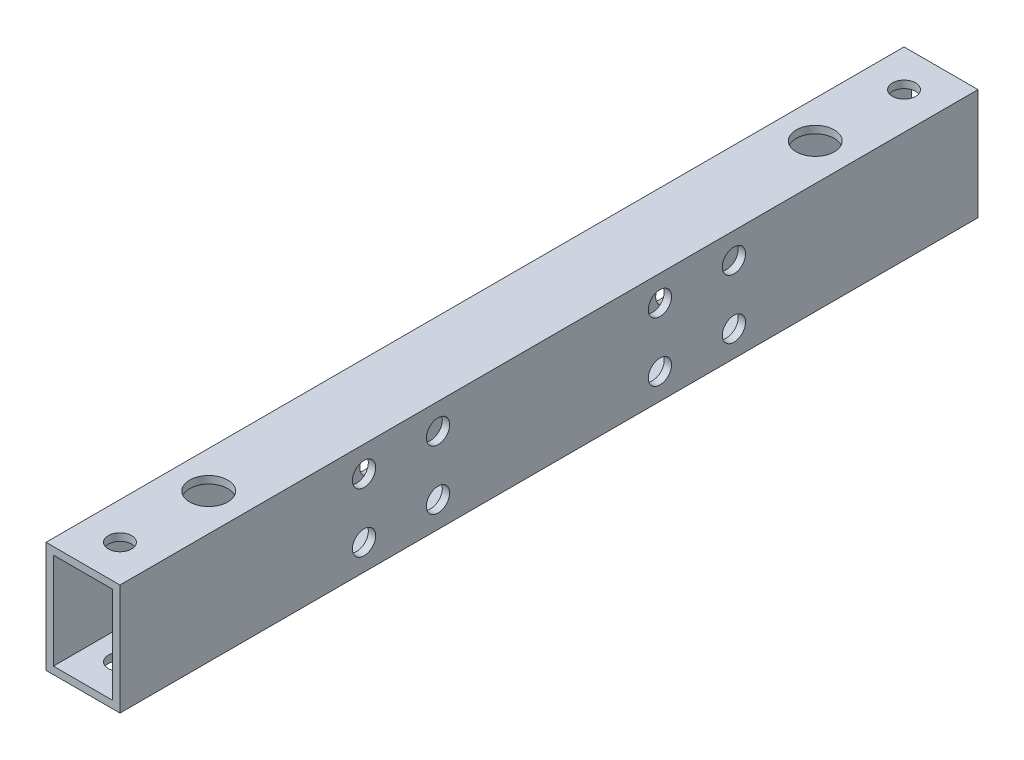
ISO-10303-21;
HEADER;
FILE_DESCRIPTION(('STEP AP214'),'2;1');
FILE_NAME('part.step','',(''),(''),'','','');
FILE_SCHEMA(('AUTOMOTIVE_DESIGN { 1 0 10303 214 1 1 1 1 }'));
ENDSEC;
DATA;
#1=APPLICATION_CONTEXT('core data for automotive mechanical design processes');
#2=APPLICATION_PROTOCOL_DEFINITION('international standard','automotive_design',2000,#1);
#3=PRODUCT_CONTEXT('',#1,'mechanical');
#4=PRODUCT('Part','Part','',(#3));
#5=PRODUCT_RELATED_PRODUCT_CATEGORY('part','',(#4));
#6=PRODUCT_DEFINITION_FORMATION('','',#4);
#7=PRODUCT_DEFINITION_CONTEXT('part definition',#1,'design');
#8=PRODUCT_DEFINITION('design','',#6,#7);
#9=PRODUCT_DEFINITION_SHAPE('','',#8);
#10=(LENGTH_UNIT() NAMED_UNIT(*) SI_UNIT(.MILLI.,.METRE.));
#11=(NAMED_UNIT(*) PLANE_ANGLE_UNIT() SI_UNIT($,.RADIAN.));
#12=(NAMED_UNIT(*) SI_UNIT($,.STERADIAN.) SOLID_ANGLE_UNIT());
#13=UNCERTAINTY_MEASURE_WITH_UNIT(LENGTH_MEASURE(1.E-05),#10,'distance_accuracy_value','');
#14=(GEOMETRIC_REPRESENTATION_CONTEXT(3) GLOBAL_UNCERTAINTY_ASSIGNED_CONTEXT((#13)) GLOBAL_UNIT_ASSIGNED_CONTEXT((#10,
#11,#12)) REPRESENTATION_CONTEXT('',''));
#15=CARTESIAN_POINT('',(0.,0.,0.));
#16=DIRECTION('',(0.,0.,1.));
#17=DIRECTION('',(1.,0.,0.));
#18=AXIS2_PLACEMENT_3D('',#15,#16,#17);
#19=CARTESIAN_POINT('',(0.,0.,116.));
#20=DIRECTION('',(0.,0.,1.));
#21=DIRECTION('',(1.,0.,0.));
#22=AXIS2_PLACEMENT_3D('',#19,#20,#21);
#23=PLANE('',#22);
#24=DIRECTION('',(0.,-1.,0.));
#25=VECTOR('',#24,1.);
#26=CARTESIAN_POINT('',(0.,0.,116.));
#27=LINE('',#26,#25);
#28=CARTESIAN_POINT('',(0.,0.,116.));
#29=VERTEX_POINT('',#28);
#30=CARTESIAN_POINT('',(0.,-15.,116.));
#31=VERTEX_POINT('',#30);
#32=EDGE_CURVE('E184',#29,#31,#27,.T.);
#33=ORIENTED_EDGE('',*,*,#32,.T.);
#34=DIRECTION('',(1.,0.,0.));
#35=VECTOR('',#34,1.);
#36=CARTESIAN_POINT('',(0.,-15.,116.));
#37=LINE('',#36,#35);
#38=CARTESIAN_POINT('',(10.,-15.,116.));
#39=VERTEX_POINT('',#38);
#40=EDGE_CURVE('E188',#31,#39,#37,.T.);
#41=ORIENTED_EDGE('',*,*,#40,.T.);
#42=DIRECTION('',(0.,-1.,0.));
#43=VECTOR('',#42,1.);
#44=CARTESIAN_POINT('',(10.,0.,116.));
#45=LINE('',#44,#43);
#46=CARTESIAN_POINT('',(10.,0.,116.));
#47=VERTEX_POINT('',#46);
#48=EDGE_CURVE('E192',#47,#39,#45,.T.);
#49=ORIENTED_EDGE('',*,*,#48,.F.);
#50=DIRECTION('',(1.,0.,0.));
#51=VECTOR('',#50,1.);
#52=CARTESIAN_POINT('',(0.,0.,116.));
#53=LINE('',#52,#51);
#54=EDGE_CURVE('E196',#29,#47,#53,.T.);
#55=ORIENTED_EDGE('',*,*,#54,.F.);
#56=EDGE_LOOP('',(#33,#41,#49,#55));
#57=FACE_BOUND('',#56,.T.);
#58=DIRECTION('',(1.,0.,0.));
#59=VECTOR('',#58,1.);
#60=CARTESIAN_POINT('',(0.,-14.,116.));
#61=LINE('',#60,#59);
#62=CARTESIAN_POINT('',(1.,-14.,116.));
#63=VERTEX_POINT('',#62);
#64=CARTESIAN_POINT('',(9.,-14.,116.));
#65=VERTEX_POINT('',#64);
#66=EDGE_CURVE('E145',#63,#65,#61,.T.);
#67=ORIENTED_EDGE('',*,*,#66,.F.);
#68=DIRECTION('',(0.,-1.,0.));
#69=VECTOR('',#68,1.);
#70=CARTESIAN_POINT('',(1.,0.,116.));
#71=LINE('',#70,#69);
#72=CARTESIAN_POINT('',(1.,-1.,116.));
#73=VERTEX_POINT('',#72);
#74=EDGE_CURVE('E135',#73,#63,#71,.T.);
#75=ORIENTED_EDGE('',*,*,#74,.F.);
#76=DIRECTION('',(1.,0.,0.));
#77=VECTOR('',#76,1.);
#78=CARTESIAN_POINT('',(0.,-1.,116.));
#79=LINE('',#78,#77);
#80=CARTESIAN_POINT('',(9.,-1.,116.));
#81=VERTEX_POINT('',#80);
#82=EDGE_CURVE('E159',#73,#81,#79,.T.);
#83=ORIENTED_EDGE('',*,*,#82,.T.);
#84=DIRECTION('',(0.,-1.,0.));
#85=VECTOR('',#84,1.);
#86=CARTESIAN_POINT('',(9.,0.,116.));
#87=LINE('',#86,#85);
#88=EDGE_CURVE('E85',#81,#65,#87,.T.);
#89=ORIENTED_EDGE('',*,*,#88,.T.);
#90=EDGE_LOOP('',(#67,#75,#83,#89));
#91=FACE_BOUND('',#90,.T.);
#92=ADVANCED_FACE('F67',(#57,#91),#23,.T.);
#93=CARTESIAN_POINT('',(0.,0.,0.));
#94=DIRECTION('',(0.,0.,1.));
#95=DIRECTION('',(1.,0.,0.));
#96=AXIS2_PLACEMENT_3D('',#93,#94,#95);
#97=PLANE('',#96);
#98=DIRECTION('',(0.,-1.,0.));
#99=VECTOR('',#98,1.);
#100=CARTESIAN_POINT('',(0.,0.,0.));
#101=LINE('',#100,#99);
#102=CARTESIAN_POINT('',(0.,0.,0.));
#103=VERTEX_POINT('',#102);
#104=CARTESIAN_POINT('',(0.,-15.,0.));
#105=VERTEX_POINT('',#104);
#106=EDGE_CURVE('E153',#103,#105,#101,.T.);
#107=ORIENTED_EDGE('',*,*,#106,.F.);
#108=DIRECTION('',(1.,0.,0.));
#109=VECTOR('',#108,1.);
#110=CARTESIAN_POINT('',(0.,0.,0.));
#111=LINE('',#110,#109);
#112=CARTESIAN_POINT('',(10.,0.,0.));
#113=VERTEX_POINT('',#112);
#114=EDGE_CURVE('E189',#103,#113,#111,.T.);
#115=ORIENTED_EDGE('',*,*,#114,.T.);
#116=DIRECTION('',(0.,-1.,0.));
#117=VECTOR('',#116,1.);
#118=CARTESIAN_POINT('',(10.,0.,0.));
#119=LINE('',#118,#117);
#120=CARTESIAN_POINT('',(10.,-15.,0.));
#121=VERTEX_POINT('',#120);
#122=EDGE_CURVE('E208',#113,#121,#119,.T.);
#123=ORIENTED_EDGE('',*,*,#122,.T.);
#124=DIRECTION('',(1.,0.,0.));
#125=VECTOR('',#124,1.);
#126=CARTESIAN_POINT('',(0.,-15.,0.));
#127=LINE('',#126,#125);
#128=EDGE_CURVE('E204',#105,#121,#127,.T.);
#129=ORIENTED_EDGE('',*,*,#128,.F.);
#130=EDGE_LOOP('',(#107,#115,#123,#129));
#131=FACE_BOUND('',#130,.T.);
#132=DIRECTION('',(0.,-1.,0.));
#133=VECTOR('',#132,1.);
#134=CARTESIAN_POINT('',(1.,0.,0.));
#135=LINE('',#134,#133);
#136=CARTESIAN_POINT('',(1.,-1.,0.));
#137=VERTEX_POINT('',#136);
#138=CARTESIAN_POINT('',(1.,-14.,0.));
#139=VERTEX_POINT('',#138);
#140=EDGE_CURVE('E93',#137,#139,#135,.T.);
#141=ORIENTED_EDGE('',*,*,#140,.T.);
#142=DIRECTION('',(1.,0.,0.));
#143=VECTOR('',#142,1.);
#144=CARTESIAN_POINT('',(0.,-14.,0.));
#145=LINE('',#144,#143);
#146=CARTESIAN_POINT('',(9.,-14.,0.));
#147=VERTEX_POINT('',#146);
#148=EDGE_CURVE('E151',#139,#147,#145,.T.);
#149=ORIENTED_EDGE('',*,*,#148,.T.);
#150=DIRECTION('',(0.,-1.,0.));
#151=VECTOR('',#150,1.);
#152=CARTESIAN_POINT('',(9.,0.,0.));
#153=LINE('',#152,#151);
#154=CARTESIAN_POINT('',(9.,-1.,0.));
#155=VERTEX_POINT('',#154);
#156=EDGE_CURVE('E170',#155,#147,#153,.T.);
#157=ORIENTED_EDGE('',*,*,#156,.F.);
#158=DIRECTION('',(1.,0.,0.));
#159=VECTOR('',#158,1.);
#160=CARTESIAN_POINT('',(0.,-1.,0.));
#161=LINE('',#160,#159);
#162=EDGE_CURVE('E146',#137,#155,#161,.T.);
#163=ORIENTED_EDGE('',*,*,#162,.F.);
#164=EDGE_LOOP('',(#141,#149,#157,#163));
#165=FACE_BOUND('',#164,.T.);
#166=ADVANCED_FACE('F368',(#131,#165),#97,.F.);
#167=CARTESIAN_POINT('',(0.,0.,116.));
#168=DIRECTION('',(1.,0.,0.));
#169=DIRECTION('',(0.,1.,0.));
#170=AXIS2_PLACEMENT_3D('',#167,#168,#169);
#171=PLANE('',#170);
#172=CARTESIAN_POINT('',(0.,-11.5,83.));
#173=DIRECTION('',(-1.,0.,0.));
#174=DIRECTION('',(0.,-1.,0.));
#175=AXIS2_PLACEMENT_3D('',#172,#173,#174);
#176=CIRCLE('',#175,1.57499999999999);
#177=CARTESIAN_POINT('',(0.,-13.075,83.));
#178=VERTEX_POINT('',#177);
#179=EDGE_CURVE('E836',#178,#178,#176,.T.);
#180=ORIENTED_EDGE('',*,*,#179,.F.);
#181=EDGE_LOOP('',(#180));
#182=FACE_BOUND('',#181,.T.);
#183=CARTESIAN_POINT('',(0.,-11.5,33.));
#184=DIRECTION('',(-1.,0.,0.));
#185=DIRECTION('',(0.,1.,0.));
#186=AXIS2_PLACEMENT_3D('',#183,#184,#185);
#187=CIRCLE('',#186,1.575);
#188=CARTESIAN_POINT('',(0.,-9.925,33.));
#189=VERTEX_POINT('',#188);
#190=EDGE_CURVE('E841',#189,#189,#187,.T.);
#191=ORIENTED_EDGE('',*,*,#190,.F.);
#192=EDGE_LOOP('',(#191));
#193=FACE_BOUND('',#192,.T.);
#194=CARTESIAN_POINT('',(0.,-11.5,43.));
#195=DIRECTION('',(-1.,0.,0.));
#196=DIRECTION('',(0.,-1.,0.));
#197=AXIS2_PLACEMENT_3D('',#194,#195,#196);
#198=CIRCLE('',#197,1.575);
#199=CARTESIAN_POINT('',(0.,-13.075,43.));
#200=VERTEX_POINT('',#199);
#201=EDGE_CURVE('E851',#200,#200,#198,.T.);
#202=ORIENTED_EDGE('',*,*,#201,.F.);
#203=EDGE_LOOP('',(#202));
#204=FACE_BOUND('',#203,.T.);
#205=CARTESIAN_POINT('',(0.,-3.5,43.));
#206=DIRECTION('',(-1.,0.,0.));
#207=DIRECTION('',(0.,1.,0.));
#208=AXIS2_PLACEMENT_3D('',#205,#206,#207);
#209=CIRCLE('',#208,1.575);
#210=CARTESIAN_POINT('',(0.,-1.925,43.));
#211=VERTEX_POINT('',#210);
#212=EDGE_CURVE('E436',#211,#211,#209,.T.);
#213=ORIENTED_EDGE('',*,*,#212,.F.);
#214=EDGE_LOOP('',(#213));
#215=FACE_BOUND('',#214,.T.);
#216=CARTESIAN_POINT('',(0.,-11.5,73.));
#217=DIRECTION('',(-1.,0.,0.));
#218=DIRECTION('',(0.,1.,0.));
#219=AXIS2_PLACEMENT_3D('',#216,#217,#218);
#220=CIRCLE('',#219,1.57500000000001);
#221=CARTESIAN_POINT('',(0.,-9.92499999999999,73.));
#222=VERTEX_POINT('',#221);
#223=EDGE_CURVE('E843',#222,#222,#220,.T.);
#224=ORIENTED_EDGE('',*,*,#223,.F.);
#225=EDGE_LOOP('',(#224));
#226=FACE_BOUND('',#225,.T.);
#227=CARTESIAN_POINT('',(0.,-3.49999999999999,73.));
#228=DIRECTION('',(-1.,0.,0.));
#229=DIRECTION('',(0.,-1.,0.));
#230=AXIS2_PLACEMENT_3D('',#227,#228,#229);
#231=CIRCLE('',#230,1.57500000000001);
#232=CARTESIAN_POINT('',(0.,-5.075,73.));
#233=VERTEX_POINT('',#232);
#234=EDGE_CURVE('E870',#233,#233,#231,.T.);
#235=ORIENTED_EDGE('',*,*,#234,.F.);
#236=EDGE_LOOP('',(#235));
#237=FACE_BOUND('',#236,.T.);
#238=CARTESIAN_POINT('',(0.,-3.49999999999999,83.));
#239=DIRECTION('',(-1.,0.,0.));
#240=DIRECTION('',(0.,1.,0.));
#241=AXIS2_PLACEMENT_3D('',#238,#239,#240);
#242=CIRCLE('',#241,1.57499999999999);
#243=CARTESIAN_POINT('',(0.,-1.925,83.));
#244=VERTEX_POINT('',#243);
#245=EDGE_CURVE('E864',#244,#244,#242,.T.);
#246=ORIENTED_EDGE('',*,*,#245,.F.);
#247=EDGE_LOOP('',(#246));
#248=FACE_BOUND('',#247,.T.);
#249=CARTESIAN_POINT('',(0.,-3.5,33.));
#250=DIRECTION('',(-1.,0.,0.));
#251=DIRECTION('',(0.,-1.,0.));
#252=AXIS2_PLACEMENT_3D('',#249,#250,#251);
#253=CIRCLE('',#252,1.575);
#254=CARTESIAN_POINT('',(0.,-5.075,33.));
#255=VERTEX_POINT('',#254);
#256=EDGE_CURVE('E432',#255,#255,#253,.T.);
#257=ORIENTED_EDGE('',*,*,#256,.F.);
#258=EDGE_LOOP('',(#257));
#259=FACE_BOUND('',#258,.T.);
#260=ORIENTED_EDGE('',*,*,#106,.T.);
#261=DIRECTION('',(0.,0.,-1.));
#262=VECTOR('',#261,1.);
#263=CARTESIAN_POINT('',(0.,-15.,116.));
#264=LINE('',#263,#262);
#265=EDGE_CURVE('E12',#31,#105,#264,.T.);
#266=ORIENTED_EDGE('',*,*,#265,.F.);
#267=ORIENTED_EDGE('',*,*,#32,.F.);
#268=DIRECTION('',(0.,0.,-1.));
#269=VECTOR('',#268,1.);
#270=CARTESIAN_POINT('',(0.,0.,116.));
#271=LINE('',#270,#269);
#272=EDGE_CURVE('E200',#29,#103,#271,.T.);
#273=ORIENTED_EDGE('',*,*,#272,.T.);
#274=EDGE_LOOP('',(#260,#266,#267,#273));
#275=FACE_BOUND('',#274,.T.);
#276=ADVANCED_FACE('F69',(#182,#193,#204,#215,#226,#237,#248,#259,#275),#171,.F.);
#277=CARTESIAN_POINT('',(0.,-15.,116.));
#278=DIRECTION('',(0.,1.,0.));
#279=DIRECTION('',(0.,0.,1.));
#280=AXIS2_PLACEMENT_3D('',#277,#278,#279);
#281=PLANE('',#280);
#282=CARTESIAN_POINT('',(5.,-15.,5.));
#283=DIRECTION('',(0.,1.,0.));
#284=DIRECTION('',(0.,0.,1.));
#285=AXIS2_PLACEMENT_3D('',#282,#283,#284);
#286=CIRCLE('',#285,1.575);
#287=CARTESIAN_POINT('',(5.,-15.,6.575));
#288=VERTEX_POINT('',#287);
#289=EDGE_CURVE('E227',#288,#288,#286,.T.);
#290=ORIENTED_EDGE('',*,*,#289,.T.);
#291=EDGE_LOOP('',(#290));
#292=FACE_BOUND('',#291,.T.);
#293=CARTESIAN_POINT('',(5.,-15.,17.));
#294=DIRECTION('',(0.,1.,0.));
#295=DIRECTION('',(0.,0.,1.));
#296=AXIS2_PLACEMENT_3D('',#293,#294,#295);
#297=CIRCLE('',#296,2.575);
#298=CARTESIAN_POINT('',(5.,-15.,19.575));
#299=VERTEX_POINT('',#298);
#300=EDGE_CURVE('E305',#299,#299,#297,.T.);
#301=ORIENTED_EDGE('',*,*,#300,.T.);
#302=EDGE_LOOP('',(#301));
#303=FACE_BOUND('',#302,.T.);
#304=CARTESIAN_POINT('',(5.,-15.,99.));
#305=DIRECTION('',(0.,1.,0.));
#306=DIRECTION('',(0.,0.,-1.));
#307=AXIS2_PLACEMENT_3D('',#304,#305,#306);
#308=CIRCLE('',#307,2.57500000000001);
#309=CARTESIAN_POINT('',(5.,-15.,96.425));
#310=VERTEX_POINT('',#309);
#311=EDGE_CURVE('E313',#310,#310,#308,.T.);
#312=ORIENTED_EDGE('',*,*,#311,.T.);
#313=EDGE_LOOP('',(#312));
#314=FACE_BOUND('',#313,.T.);
#315=CARTESIAN_POINT('',(5.,-15.,111.));
#316=DIRECTION('',(0.,1.,0.));
#317=DIRECTION('',(0.,0.,-1.));
#318=AXIS2_PLACEMENT_3D('',#315,#316,#317);
#319=CIRCLE('',#318,1.575);
#320=CARTESIAN_POINT('',(5.,-15.,109.425));
#321=VERTEX_POINT('',#320);
#322=EDGE_CURVE('E293',#321,#321,#319,.T.);
#323=ORIENTED_EDGE('',*,*,#322,.T.);
#324=EDGE_LOOP('',(#323));
#325=FACE_BOUND('',#324,.T.);
#326=ORIENTED_EDGE('',*,*,#128,.T.);
#327=DIRECTION('',(0.,0.,-1.));
#328=VECTOR('',#327,1.);
#329=CARTESIAN_POINT('',(10.,-15.,116.));
#330=LINE('',#329,#328);
#331=EDGE_CURVE('E77',#39,#121,#330,.T.);
#332=ORIENTED_EDGE('',*,*,#331,.F.);
#333=ORIENTED_EDGE('',*,*,#40,.F.);
#334=ORIENTED_EDGE('',*,*,#265,.T.);
#335=EDGE_LOOP('',(#326,#332,#333,#334));
#336=FACE_BOUND('',#335,.T.);
#337=ADVANCED_FACE('F358',(#292,#303,#314,#325,#336),#281,.F.);
#338=CARTESIAN_POINT('',(10.,0.,116.));
#339=DIRECTION('',(1.,0.,0.));
#340=DIRECTION('',(0.,1.,0.));
#341=AXIS2_PLACEMENT_3D('',#338,#339,#340);
#342=PLANE('',#341);
#343=CARTESIAN_POINT('',(10.,-11.5,83.));
#344=DIRECTION('',(-1.,0.,0.));
#345=DIRECTION('',(0.,-1.,0.));
#346=AXIS2_PLACEMENT_3D('',#343,#344,#345);
#347=CIRCLE('',#346,1.57499999999999);
#348=CARTESIAN_POINT('',(10.,-13.075,83.));
#349=VERTEX_POINT('',#348);
#350=EDGE_CURVE('E403',#349,#349,#347,.T.);
#351=ORIENTED_EDGE('',*,*,#350,.T.);
#352=EDGE_LOOP('',(#351));
#353=FACE_BOUND('',#352,.T.);
#354=CARTESIAN_POINT('',(10.,-11.5,33.));
#355=DIRECTION('',(-1.,0.,0.));
#356=DIRECTION('',(0.,1.,0.));
#357=AXIS2_PLACEMENT_3D('',#354,#355,#356);
#358=CIRCLE('',#357,1.575);
#359=CARTESIAN_POINT('',(10.,-9.925,33.));
#360=VERTEX_POINT('',#359);
#361=EDGE_CURVE('E407',#360,#360,#358,.T.);
#362=ORIENTED_EDGE('',*,*,#361,.T.);
#363=EDGE_LOOP('',(#362));
#364=FACE_BOUND('',#363,.T.);
#365=CARTESIAN_POINT('',(10.,-11.5,43.));
#366=DIRECTION('',(-1.,0.,0.));
#367=DIRECTION('',(0.,-1.,0.));
#368=AXIS2_PLACEMENT_3D('',#365,#366,#367);
#369=CIRCLE('',#368,1.575);
#370=CARTESIAN_POINT('',(10.,-13.075,43.));
#371=VERTEX_POINT('',#370);
#372=EDGE_CURVE('E411',#371,#371,#369,.T.);
#373=ORIENTED_EDGE('',*,*,#372,.T.);
#374=EDGE_LOOP('',(#373));
#375=FACE_BOUND('',#374,.T.);
#376=CARTESIAN_POINT('',(10.,-3.5,43.));
#377=DIRECTION('',(-1.,0.,0.));
#378=DIRECTION('',(0.,1.,0.));
#379=AXIS2_PLACEMENT_3D('',#376,#377,#378);
#380=CIRCLE('',#379,1.575);
#381=CARTESIAN_POINT('',(10.,-1.925,43.));
#382=VERTEX_POINT('',#381);
#383=EDGE_CURVE('E415',#382,#382,#380,.T.);
#384=ORIENTED_EDGE('',*,*,#383,.T.);
#385=EDGE_LOOP('',(#384));
#386=FACE_BOUND('',#385,.T.);
#387=CARTESIAN_POINT('',(10.,-11.5,73.));
#388=DIRECTION('',(-1.,0.,0.));
#389=DIRECTION('',(0.,1.,0.));
#390=AXIS2_PLACEMENT_3D('',#387,#388,#389);
#391=CIRCLE('',#390,1.57500000000001);
#392=CARTESIAN_POINT('',(10.,-9.92499999999999,73.));
#393=VERTEX_POINT('',#392);
#394=EDGE_CURVE('E419',#393,#393,#391,.T.);
#395=ORIENTED_EDGE('',*,*,#394,.T.);
#396=EDGE_LOOP('',(#395));
#397=FACE_BOUND('',#396,.T.);
#398=CARTESIAN_POINT('',(10.,-3.49999999999999,73.));
#399=DIRECTION('',(-1.,0.,0.));
#400=DIRECTION('',(0.,-1.,0.));
#401=AXIS2_PLACEMENT_3D('',#398,#399,#400);
#402=CIRCLE('',#401,1.57500000000001);
#403=CARTESIAN_POINT('',(10.,-5.075,73.));
#404=VERTEX_POINT('',#403);
#405=EDGE_CURVE('E423',#404,#404,#402,.T.);
#406=ORIENTED_EDGE('',*,*,#405,.T.);
#407=EDGE_LOOP('',(#406));
#408=FACE_BOUND('',#407,.T.);
#409=CARTESIAN_POINT('',(10.,-3.49999999999999,83.));
#410=DIRECTION('',(-1.,0.,0.));
#411=DIRECTION('',(0.,1.,0.));
#412=AXIS2_PLACEMENT_3D('',#409,#410,#411);
#413=CIRCLE('',#412,1.57499999999999);
#414=CARTESIAN_POINT('',(10.,-1.925,83.));
#415=VERTEX_POINT('',#414);
#416=EDGE_CURVE('E427',#415,#415,#413,.T.);
#417=ORIENTED_EDGE('',*,*,#416,.T.);
#418=EDGE_LOOP('',(#417));
#419=FACE_BOUND('',#418,.T.);
#420=CARTESIAN_POINT('',(10.,-3.5,33.));
#421=DIRECTION('',(-1.,0.,0.));
#422=DIRECTION('',(0.,-1.,0.));
#423=AXIS2_PLACEMENT_3D('',#420,#421,#422);
#424=CIRCLE('',#423,1.575);
#425=CARTESIAN_POINT('',(10.,-5.075,33.));
#426=VERTEX_POINT('',#425);
#427=EDGE_CURVE('E247',#426,#426,#424,.T.);
#428=ORIENTED_EDGE('',*,*,#427,.T.);
#429=EDGE_LOOP('',(#428));
#430=FACE_BOUND('',#429,.T.);
#431=ORIENTED_EDGE('',*,*,#122,.F.);
#432=DIRECTION('',(0.,0.,-1.));
#433=VECTOR('',#432,1.);
#434=CARTESIAN_POINT('',(10.,0.,116.));
#435=LINE('',#434,#433);
#436=EDGE_CURVE('E217',#47,#113,#435,.T.);
#437=ORIENTED_EDGE('',*,*,#436,.F.);
#438=ORIENTED_EDGE('',*,*,#48,.T.);
#439=ORIENTED_EDGE('',*,*,#331,.T.);
#440=EDGE_LOOP('',(#431,#437,#438,#439));
#441=FACE_BOUND('',#440,.T.);
#442=ADVANCED_FACE('F361',(#353,#364,#375,#386,#397,#408,#419,#430,#441),#342,.T.);
#443=CARTESIAN_POINT('',(0.,0.,116.));
#444=DIRECTION('',(0.,1.,0.));
#445=DIRECTION('',(0.,0.,1.));
#446=AXIS2_PLACEMENT_3D('',#443,#444,#445);
#447=PLANE('',#446);
#448=CARTESIAN_POINT('',(5.,0.,5.));
#449=DIRECTION('',(0.,1.,0.));
#450=DIRECTION('',(0.,0.,1.));
#451=AXIS2_PLACEMENT_3D('',#448,#449,#450);
#452=CIRCLE('',#451,1.575);
#453=CARTESIAN_POINT('',(5.,0.,6.575));
#454=VERTEX_POINT('',#453);
#455=EDGE_CURVE('E297',#454,#454,#452,.T.);
#456=ORIENTED_EDGE('',*,*,#455,.F.);
#457=EDGE_LOOP('',(#456));
#458=FACE_BOUND('',#457,.T.);
#459=CARTESIAN_POINT('',(5.,0.,17.));
#460=DIRECTION('',(0.,1.,0.));
#461=DIRECTION('',(0.,0.,1.));
#462=AXIS2_PLACEMENT_3D('',#459,#460,#461);
#463=CIRCLE('',#462,2.575);
#464=CARTESIAN_POINT('',(5.,0.,19.575));
#465=VERTEX_POINT('',#464);
#466=EDGE_CURVE('E301',#465,#465,#463,.T.);
#467=ORIENTED_EDGE('',*,*,#466,.F.);
#468=EDGE_LOOP('',(#467));
#469=FACE_BOUND('',#468,.T.);
#470=CARTESIAN_POINT('',(5.,0.,99.));
#471=DIRECTION('',(0.,1.,0.));
#472=DIRECTION('',(0.,0.,-1.));
#473=AXIS2_PLACEMENT_3D('',#470,#471,#472);
#474=CIRCLE('',#473,2.57500000000001);
#475=CARTESIAN_POINT('',(5.,0.,96.425));
#476=VERTEX_POINT('',#475);
#477=EDGE_CURVE('E309',#476,#476,#474,.T.);
#478=ORIENTED_EDGE('',*,*,#477,.F.);
#479=EDGE_LOOP('',(#478));
#480=FACE_BOUND('',#479,.T.);
#481=CARTESIAN_POINT('',(5.,0.,111.));
#482=DIRECTION('',(0.,1.,0.));
#483=DIRECTION('',(0.,0.,-1.));
#484=AXIS2_PLACEMENT_3D('',#481,#482,#483);
#485=CIRCLE('',#484,1.575);
#486=CARTESIAN_POINT('',(5.,0.,109.425));
#487=VERTEX_POINT('',#486);
#488=EDGE_CURVE('E317',#487,#487,#485,.T.);
#489=ORIENTED_EDGE('',*,*,#488,.F.);
#490=EDGE_LOOP('',(#489));
#491=FACE_BOUND('',#490,.T.);
#492=ORIENTED_EDGE('',*,*,#114,.F.);
#493=ORIENTED_EDGE('',*,*,#272,.F.);
#494=ORIENTED_EDGE('',*,*,#54,.T.);
#495=ORIENTED_EDGE('',*,*,#436,.T.);
#496=EDGE_LOOP('',(#492,#493,#494,#495));
#497=FACE_BOUND('',#496,.T.);
#498=ADVANCED_FACE('F376',(#458,#469,#480,#491,#497),#447,.T.);
#499=CARTESIAN_POINT('',(1.,0.,116.));
#500=DIRECTION('',(1.,0.,0.));
#501=DIRECTION('',(0.,1.,0.));
#502=AXIS2_PLACEMENT_3D('',#499,#500,#501);
#503=PLANE('',#502);
#504=CARTESIAN_POINT('',(1.,-11.5,83.));
#505=DIRECTION('',(1.,0.,0.));
#506=DIRECTION('',(0.,1.,0.));
#507=AXIS2_PLACEMENT_3D('',#504,#505,#506);
#508=CIRCLE('',#507,1.57499999999999);
#509=CARTESIAN_POINT('',(1.,-9.925,83.));
#510=VERTEX_POINT('',#509);
#511=EDGE_CURVE('E289',#510,#510,#508,.T.);
#512=ORIENTED_EDGE('',*,*,#511,.F.);
#513=EDGE_LOOP('',(#512));
#514=FACE_BOUND('',#513,.T.);
#515=CARTESIAN_POINT('',(1.,-11.5,33.));
#516=DIRECTION('',(1.,0.,0.));
#517=DIRECTION('',(0.,1.,0.));
#518=AXIS2_PLACEMENT_3D('',#515,#516,#517);
#519=CIRCLE('',#518,1.575);
#520=CARTESIAN_POINT('',(1.,-9.925,33.));
#521=VERTEX_POINT('',#520);
#522=EDGE_CURVE('E275',#521,#521,#519,.T.);
#523=ORIENTED_EDGE('',*,*,#522,.F.);
#524=EDGE_LOOP('',(#523));
#525=FACE_BOUND('',#524,.T.);
#526=CARTESIAN_POINT('',(1.,-11.5,43.));
#527=DIRECTION('',(1.,0.,0.));
#528=DIRECTION('',(0.,1.,0.));
#529=AXIS2_PLACEMENT_3D('',#526,#527,#528);
#530=CIRCLE('',#529,1.575);
#531=CARTESIAN_POINT('',(1.,-9.925,43.));
#532=VERTEX_POINT('',#531);
#533=EDGE_CURVE('E271',#532,#532,#530,.T.);
#534=ORIENTED_EDGE('',*,*,#533,.F.);
#535=EDGE_LOOP('',(#534));
#536=FACE_BOUND('',#535,.T.);
#537=CARTESIAN_POINT('',(1.,-3.5,43.));
#538=DIRECTION('',(1.,0.,0.));
#539=DIRECTION('',(0.,1.,0.));
#540=AXIS2_PLACEMENT_3D('',#537,#538,#539);
#541=CIRCLE('',#540,1.575);
#542=CARTESIAN_POINT('',(1.,-1.925,43.));
#543=VERTEX_POINT('',#542);
#544=EDGE_CURVE('E267',#543,#543,#541,.T.);
#545=ORIENTED_EDGE('',*,*,#544,.F.);
#546=EDGE_LOOP('',(#545));
#547=FACE_BOUND('',#546,.T.);
#548=CARTESIAN_POINT('',(1.,-11.5,73.));
#549=DIRECTION('',(1.,0.,0.));
#550=DIRECTION('',(0.,1.,0.));
#551=AXIS2_PLACEMENT_3D('',#548,#549,#550);
#552=CIRCLE('',#551,1.57500000000001);
#553=CARTESIAN_POINT('',(1.,-9.92499999999999,73.));
#554=VERTEX_POINT('',#553);
#555=EDGE_CURVE('E262',#554,#554,#552,.T.);
#556=ORIENTED_EDGE('',*,*,#555,.F.);
#557=EDGE_LOOP('',(#556));
#558=FACE_BOUND('',#557,.T.);
#559=CARTESIAN_POINT('',(1.,-3.49999999999999,73.));
#560=DIRECTION('',(1.,0.,0.));
#561=DIRECTION('',(0.,1.,0.));
#562=AXIS2_PLACEMENT_3D('',#559,#560,#561);
#563=CIRCLE('',#562,1.57500000000001);
#564=CARTESIAN_POINT('',(1.,-1.92499999999999,73.));
#565=VERTEX_POINT('',#564);
#566=EDGE_CURVE('E257',#565,#565,#563,.T.);
#567=ORIENTED_EDGE('',*,*,#566,.F.);
#568=EDGE_LOOP('',(#567));
#569=FACE_BOUND('',#568,.T.);
#570=CARTESIAN_POINT('',(1.,-3.49999999999999,83.));
#571=DIRECTION('',(1.,0.,0.));
#572=DIRECTION('',(0.,1.,0.));
#573=AXIS2_PLACEMENT_3D('',#570,#571,#572);
#574=CIRCLE('',#573,1.57499999999999);
#575=CARTESIAN_POINT('',(1.,-1.925,83.));
#576=VERTEX_POINT('',#575);
#577=EDGE_CURVE('E252',#576,#576,#574,.T.);
#578=ORIENTED_EDGE('',*,*,#577,.F.);
#579=EDGE_LOOP('',(#578));
#580=FACE_BOUND('',#579,.T.);
#581=CARTESIAN_POINT('',(1.,-3.5,33.));
#582=DIRECTION('',(1.,0.,0.));
#583=DIRECTION('',(0.,1.,0.));
#584=AXIS2_PLACEMENT_3D('',#581,#582,#583);
#585=CIRCLE('',#584,1.575);
#586=CARTESIAN_POINT('',(1.,-1.925,33.));
#587=VERTEX_POINT('',#586);
#588=EDGE_CURVE('E246',#587,#587,#585,.T.);
#589=ORIENTED_EDGE('',*,*,#588,.F.);
#590=EDGE_LOOP('',(#589));
#591=FACE_BOUND('',#590,.T.);
#592=ORIENTED_EDGE('',*,*,#140,.F.);
#593=DIRECTION('',(0.,0.,-1.));
#594=VECTOR('',#593,1.);
#595=CARTESIAN_POINT('',(1.,-1.,116.));
#596=LINE('',#595,#594);
#597=EDGE_CURVE('E139',#73,#137,#596,.T.);
#598=ORIENTED_EDGE('',*,*,#597,.F.);
#599=ORIENTED_EDGE('',*,*,#74,.T.);
#600=DIRECTION('',(0.,0.,-1.));
#601=VECTOR('',#600,1.);
#602=CARTESIAN_POINT('',(1.,-14.,116.));
#603=LINE('',#602,#601);
#604=EDGE_CURVE('E138',#63,#139,#603,.T.);
#605=ORIENTED_EDGE('',*,*,#604,.T.);
#606=EDGE_LOOP('',(#592,#598,#599,#605));
#607=FACE_BOUND('',#606,.T.);
#608=ADVANCED_FACE('F137',(#514,#525,#536,#547,#558,#569,#580,#591,#607),#503,.T.);
#609=CARTESIAN_POINT('',(0.,-14.,116.));
#610=DIRECTION('',(0.,1.,0.));
#611=DIRECTION('',(0.,0.,1.));
#612=AXIS2_PLACEMENT_3D('',#609,#610,#611);
#613=PLANE('',#612);
#614=CARTESIAN_POINT('',(5.,-14.,5.));
#615=DIRECTION('',(0.,1.,0.));
#616=DIRECTION('',(0.,0.,1.));
#617=AXIS2_PLACEMENT_3D('',#614,#615,#616);
#618=CIRCLE('',#617,1.575);
#619=CARTESIAN_POINT('',(5.,-14.,6.575));
#620=VERTEX_POINT('',#619);
#621=EDGE_CURVE('E167',#620,#620,#618,.T.);
#622=ORIENTED_EDGE('',*,*,#621,.F.);
#623=EDGE_LOOP('',(#622));
#624=FACE_BOUND('',#623,.T.);
#625=CARTESIAN_POINT('',(5.,-14.,17.));
#626=DIRECTION('',(0.,1.,0.));
#627=DIRECTION('',(0.,0.,1.));
#628=AXIS2_PLACEMENT_3D('',#625,#626,#627);
#629=CIRCLE('',#628,2.575);
#630=CARTESIAN_POINT('',(5.,-14.,19.575));
#631=VERTEX_POINT('',#630);
#632=EDGE_CURVE('E237',#631,#631,#629,.T.);
#633=ORIENTED_EDGE('',*,*,#632,.F.);
#634=EDGE_LOOP('',(#633));
#635=FACE_BOUND('',#634,.T.);
#636=CARTESIAN_POINT('',(5.,-14.,99.));
#637=DIRECTION('',(0.,1.,0.));
#638=DIRECTION('',(0.,0.,1.));
#639=AXIS2_PLACEMENT_3D('',#636,#637,#638);
#640=CIRCLE('',#639,2.57500000000001);
#641=CARTESIAN_POINT('',(5.,-14.,101.575));
#642=VERTEX_POINT('',#641);
#643=EDGE_CURVE('E232',#642,#642,#640,.T.);
#644=ORIENTED_EDGE('',*,*,#643,.F.);
#645=EDGE_LOOP('',(#644));
#646=FACE_BOUND('',#645,.T.);
#647=CARTESIAN_POINT('',(5.,-14.,111.));
#648=DIRECTION('',(0.,1.,0.));
#649=DIRECTION('',(0.,0.,1.));
#650=AXIS2_PLACEMENT_3D('',#647,#648,#649);
#651=CIRCLE('',#650,1.575);
#652=CARTESIAN_POINT('',(5.,-14.,112.575));
#653=VERTEX_POINT('',#652);
#654=EDGE_CURVE('E226',#653,#653,#651,.T.);
#655=ORIENTED_EDGE('',*,*,#654,.F.);
#656=EDGE_LOOP('',(#655));
#657=FACE_BOUND('',#656,.T.);
#658=ORIENTED_EDGE('',*,*,#148,.F.);
#659=ORIENTED_EDGE('',*,*,#604,.F.);
#660=ORIENTED_EDGE('',*,*,#66,.T.);
#661=DIRECTION('',(0.,0.,-1.));
#662=VECTOR('',#661,1.);
#663=CARTESIAN_POINT('',(9.,-14.,116.));
#664=LINE('',#663,#662);
#665=EDGE_CURVE('E154',#65,#147,#664,.T.);
#666=ORIENTED_EDGE('',*,*,#665,.T.);
#667=EDGE_LOOP('',(#658,#659,#660,#666));
#668=FACE_BOUND('',#667,.T.);
#669=ADVANCED_FACE('F149',(#624,#635,#646,#657,#668),#613,.T.);
#670=CARTESIAN_POINT('',(9.,0.,116.));
#671=DIRECTION('',(1.,0.,0.));
#672=DIRECTION('',(0.,1.,0.));
#673=AXIS2_PLACEMENT_3D('',#670,#671,#672);
#674=PLANE('',#673);
#675=CARTESIAN_POINT('',(9.,-11.5,83.));
#676=DIRECTION('',(1.,0.,0.));
#677=DIRECTION('',(0.,1.,0.));
#678=AXIS2_PLACEMENT_3D('',#675,#676,#677);
#679=CIRCLE('',#678,1.57499999999999);
#680=CARTESIAN_POINT('',(9.,-9.925,83.));
#681=VERTEX_POINT('',#680);
#682=EDGE_CURVE('E71',#681,#681,#679,.T.);
#683=ORIENTED_EDGE('',*,*,#682,.T.);
#684=EDGE_LOOP('',(#683));
#685=FACE_BOUND('',#684,.T.);
#686=CARTESIAN_POINT('',(9.,-11.5,33.));
#687=DIRECTION('',(1.,0.,0.));
#688=DIRECTION('',(0.,1.,0.));
#689=AXIS2_PLACEMENT_3D('',#686,#687,#688);
#690=CIRCLE('',#689,1.575);
#691=CARTESIAN_POINT('',(9.,-9.925,33.));
#692=VERTEX_POINT('',#691);
#693=EDGE_CURVE('E272',#692,#692,#690,.T.);
#694=ORIENTED_EDGE('',*,*,#693,.T.);
#695=EDGE_LOOP('',(#694));
#696=FACE_BOUND('',#695,.T.);
#697=CARTESIAN_POINT('',(9.,-11.5,43.));
#698=DIRECTION('',(1.,0.,0.));
#699=DIRECTION('',(0.,1.,0.));
#700=AXIS2_PLACEMENT_3D('',#697,#698,#699);
#701=CIRCLE('',#700,1.575);
#702=CARTESIAN_POINT('',(9.,-9.925,43.));
#703=VERTEX_POINT('',#702);
#704=EDGE_CURVE('E268',#703,#703,#701,.T.);
#705=ORIENTED_EDGE('',*,*,#704,.T.);
#706=EDGE_LOOP('',(#705));
#707=FACE_BOUND('',#706,.T.);
#708=CARTESIAN_POINT('',(9.,-3.5,43.));
#709=DIRECTION('',(1.,0.,0.));
#710=DIRECTION('',(0.,1.,0.));
#711=AXIS2_PLACEMENT_3D('',#708,#709,#710);
#712=CIRCLE('',#711,1.575);
#713=CARTESIAN_POINT('',(9.,-1.925,43.));
#714=VERTEX_POINT('',#713);
#715=EDGE_CURVE('E263',#714,#714,#712,.T.);
#716=ORIENTED_EDGE('',*,*,#715,.T.);
#717=EDGE_LOOP('',(#716));
#718=FACE_BOUND('',#717,.T.);
#719=CARTESIAN_POINT('',(9.,-11.5,73.));
#720=DIRECTION('',(1.,0.,0.));
#721=DIRECTION('',(0.,1.,0.));
#722=AXIS2_PLACEMENT_3D('',#719,#720,#721);
#723=CIRCLE('',#722,1.57500000000001);
#724=CARTESIAN_POINT('',(9.,-9.92499999999999,73.));
#725=VERTEX_POINT('',#724);
#726=EDGE_CURVE('E258',#725,#725,#723,.T.);
#727=ORIENTED_EDGE('',*,*,#726,.T.);
#728=EDGE_LOOP('',(#727));
#729=FACE_BOUND('',#728,.T.);
#730=CARTESIAN_POINT('',(9.,-3.49999999999999,73.));
#731=DIRECTION('',(1.,0.,0.));
#732=DIRECTION('',(0.,1.,0.));
#733=AXIS2_PLACEMENT_3D('',#730,#731,#732);
#734=CIRCLE('',#733,1.57500000000001);
#735=CARTESIAN_POINT('',(9.,-1.92499999999999,73.));
#736=VERTEX_POINT('',#735);
#737=EDGE_CURVE('E253',#736,#736,#734,.T.);
#738=ORIENTED_EDGE('',*,*,#737,.T.);
#739=EDGE_LOOP('',(#738));
#740=FACE_BOUND('',#739,.T.);
#741=CARTESIAN_POINT('',(9.,-3.49999999999999,83.));
#742=DIRECTION('',(1.,0.,0.));
#743=DIRECTION('',(0.,1.,0.));
#744=AXIS2_PLACEMENT_3D('',#741,#742,#743);
#745=CIRCLE('',#744,1.57499999999999);
#746=CARTESIAN_POINT('',(9.,-1.925,83.));
#747=VERTEX_POINT('',#746);
#748=EDGE_CURVE('E248',#747,#747,#745,.T.);
#749=ORIENTED_EDGE('',*,*,#748,.T.);
#750=EDGE_LOOP('',(#749));
#751=FACE_BOUND('',#750,.T.);
#752=CARTESIAN_POINT('',(9.,-3.5,33.));
#753=DIRECTION('',(1.,0.,0.));
#754=DIRECTION('',(0.,1.,0.));
#755=AXIS2_PLACEMENT_3D('',#752,#753,#754);
#756=CIRCLE('',#755,1.575);
#757=CARTESIAN_POINT('',(9.,-1.925,33.));
#758=VERTEX_POINT('',#757);
#759=EDGE_CURVE('E242',#758,#758,#756,.T.);
#760=ORIENTED_EDGE('',*,*,#759,.T.);
#761=EDGE_LOOP('',(#760));
#762=FACE_BOUND('',#761,.T.);
#763=ORIENTED_EDGE('',*,*,#156,.T.);
#764=ORIENTED_EDGE('',*,*,#665,.F.);
#765=ORIENTED_EDGE('',*,*,#88,.F.);
#766=DIRECTION('',(0.,0.,-1.));
#767=VECTOR('',#766,1.);
#768=CARTESIAN_POINT('',(9.,-1.,116.));
#769=LINE('',#768,#767);
#770=EDGE_CURVE('E179',#81,#155,#769,.T.);
#771=ORIENTED_EDGE('',*,*,#770,.T.);
#772=EDGE_LOOP('',(#763,#764,#765,#771));
#773=FACE_BOUND('',#772,.T.);
#774=ADVANCED_FACE('F341',(#685,#696,#707,#718,#729,#740,#751,#762,#773),#674,.F.);
#775=CARTESIAN_POINT('',(0.,-1.,116.));
#776=DIRECTION('',(0.,1.,0.));
#777=DIRECTION('',(0.,0.,1.));
#778=AXIS2_PLACEMENT_3D('',#775,#776,#777);
#779=PLANE('',#778);
#780=CARTESIAN_POINT('',(5.,-1.,5.));
#781=DIRECTION('',(0.,1.,0.));
#782=DIRECTION('',(0.,0.,1.));
#783=AXIS2_PLACEMENT_3D('',#780,#781,#782);
#784=CIRCLE('',#783,1.575);
#785=CARTESIAN_POINT('',(5.,-1.,6.575));
#786=VERTEX_POINT('',#785);
#787=EDGE_CURVE('E238',#786,#786,#784,.T.);
#788=ORIENTED_EDGE('',*,*,#787,.T.);
#789=EDGE_LOOP('',(#788));
#790=FACE_BOUND('',#789,.T.);
#791=CARTESIAN_POINT('',(5.,-1.,17.));
#792=DIRECTION('',(0.,1.,0.));
#793=DIRECTION('',(0.,0.,1.));
#794=AXIS2_PLACEMENT_3D('',#791,#792,#793);
#795=CIRCLE('',#794,2.575);
#796=CARTESIAN_POINT('',(5.,-1.,19.575));
#797=VERTEX_POINT('',#796);
#798=EDGE_CURVE('E233',#797,#797,#795,.T.);
#799=ORIENTED_EDGE('',*,*,#798,.T.);
#800=EDGE_LOOP('',(#799));
#801=FACE_BOUND('',#800,.T.);
#802=CARTESIAN_POINT('',(5.,-1.,99.));
#803=DIRECTION('',(0.,1.,0.));
#804=DIRECTION('',(0.,0.,1.));
#805=AXIS2_PLACEMENT_3D('',#802,#803,#804);
#806=CIRCLE('',#805,2.57500000000001);
#807=CARTESIAN_POINT('',(5.,-1.,101.575));
#808=VERTEX_POINT('',#807);
#809=EDGE_CURVE('E228',#808,#808,#806,.T.);
#810=ORIENTED_EDGE('',*,*,#809,.T.);
#811=EDGE_LOOP('',(#810));
#812=FACE_BOUND('',#811,.T.);
#813=CARTESIAN_POINT('',(5.,-1.,111.));
#814=DIRECTION('',(0.,1.,0.));
#815=DIRECTION('',(0.,0.,1.));
#816=AXIS2_PLACEMENT_3D('',#813,#814,#815);
#817=CIRCLE('',#816,1.575);
#818=CARTESIAN_POINT('',(5.,-1.,112.575));
#819=VERTEX_POINT('',#818);
#820=EDGE_CURVE('E222',#819,#819,#817,.T.);
#821=ORIENTED_EDGE('',*,*,#820,.T.);
#822=EDGE_LOOP('',(#821));
#823=FACE_BOUND('',#822,.T.);
#824=ORIENTED_EDGE('',*,*,#162,.T.);
#825=ORIENTED_EDGE('',*,*,#770,.F.);
#826=ORIENTED_EDGE('',*,*,#82,.F.);
#827=ORIENTED_EDGE('',*,*,#597,.T.);
#828=EDGE_LOOP('',(#824,#825,#826,#827));
#829=FACE_BOUND('',#828,.T.);
#830=ADVANCED_FACE('F500',(#790,#801,#812,#823,#829),#779,.F.);
#831=CARTESIAN_POINT('',(5.,-15.,111.));
#832=DIRECTION('',(0.,1.,0.));
#833=DIRECTION('',(0.,0.,1.));
#834=AXIS2_PLACEMENT_3D('',#831,#832,#833);
#835=CYLINDRICAL_SURFACE('',#834,1.575);
#836=ORIENTED_EDGE('',*,*,#488,.T.);
#837=EDGE_LOOP('',(#836));
#838=FACE_BOUND('',#837,.T.);
#839=ORIENTED_EDGE('',*,*,#820,.F.);
#840=EDGE_LOOP('',(#839));
#841=FACE_BOUND('',#840,.T.);
#842=ADVANCED_FACE('F355',(#838,#841),#835,.F.);
#843=CARTESIAN_POINT('',(5.,-15.,99.));
#844=DIRECTION('',(0.,1.,0.));
#845=DIRECTION('',(0.,0.,1.));
#846=AXIS2_PLACEMENT_3D('',#843,#844,#845);
#847=CYLINDRICAL_SURFACE('',#846,2.57500000000001);
#848=ORIENTED_EDGE('',*,*,#477,.T.);
#849=EDGE_LOOP('',(#848));
#850=FACE_BOUND('',#849,.T.);
#851=ORIENTED_EDGE('',*,*,#809,.F.);
#852=EDGE_LOOP('',(#851));
#853=FACE_BOUND('',#852,.T.);
#854=ADVANCED_FACE('F512',(#850,#853),#847,.F.);
#855=CARTESIAN_POINT('',(5.,-15.,17.));
#856=DIRECTION('',(0.,1.,0.));
#857=DIRECTION('',(0.,0.,1.));
#858=AXIS2_PLACEMENT_3D('',#855,#856,#857);
#859=CYLINDRICAL_SURFACE('',#858,2.575);
#860=ORIENTED_EDGE('',*,*,#466,.T.);
#861=EDGE_LOOP('',(#860));
#862=FACE_BOUND('',#861,.T.);
#863=ORIENTED_EDGE('',*,*,#798,.F.);
#864=EDGE_LOOP('',(#863));
#865=FACE_BOUND('',#864,.T.);
#866=ADVANCED_FACE('F521',(#862,#865),#859,.F.);
#867=CARTESIAN_POINT('',(5.,-15.,5.));
#868=DIRECTION('',(0.,1.,0.));
#869=DIRECTION('',(0.,0.,1.));
#870=AXIS2_PLACEMENT_3D('',#867,#868,#869);
#871=CYLINDRICAL_SURFACE('',#870,1.575);
#872=ORIENTED_EDGE('',*,*,#455,.T.);
#873=EDGE_LOOP('',(#872));
#874=FACE_BOUND('',#873,.T.);
#875=ORIENTED_EDGE('',*,*,#787,.F.);
#876=EDGE_LOOP('',(#875));
#877=FACE_BOUND('',#876,.T.);
#878=ADVANCED_FACE('F353',(#874,#877),#871,.F.);
#879=ORIENTED_EDGE('',*,*,#654,.T.);
#880=EDGE_LOOP('',(#879));
#881=FACE_BOUND('',#880,.T.);
#882=ORIENTED_EDGE('',*,*,#322,.F.);
#883=EDGE_LOOP('',(#882));
#884=FACE_BOUND('',#883,.T.);
#885=ADVANCED_FACE('F349',(#881,#884),#835,.F.);
#886=ORIENTED_EDGE('',*,*,#643,.T.);
#887=EDGE_LOOP('',(#886));
#888=FACE_BOUND('',#887,.T.);
#889=ORIENTED_EDGE('',*,*,#311,.F.);
#890=EDGE_LOOP('',(#889));
#891=FACE_BOUND('',#890,.T.);
#892=ADVANCED_FACE('F352',(#888,#891),#847,.F.);
#893=ORIENTED_EDGE('',*,*,#632,.T.);
#894=EDGE_LOOP('',(#893));
#895=FACE_BOUND('',#894,.T.);
#896=ORIENTED_EDGE('',*,*,#300,.F.);
#897=EDGE_LOOP('',(#896));
#898=FACE_BOUND('',#897,.T.);
#899=ADVANCED_FACE('F495',(#895,#898),#859,.F.);
#900=ORIENTED_EDGE('',*,*,#621,.T.);
#901=EDGE_LOOP('',(#900));
#902=FACE_BOUND('',#901,.T.);
#903=ORIENTED_EDGE('',*,*,#289,.F.);
#904=EDGE_LOOP('',(#903));
#905=FACE_BOUND('',#904,.T.);
#906=ADVANCED_FACE('F336',(#902,#905),#871,.F.);
#907=CARTESIAN_POINT('',(10.,-3.5,33.));
#908=DIRECTION('',(-1.,0.,0.));
#909=DIRECTION('',(0.,-1.,0.));
#910=AXIS2_PLACEMENT_3D('',#907,#908,#909);
#911=CYLINDRICAL_SURFACE('',#910,1.575);
#912=ORIENTED_EDGE('',*,*,#427,.F.);
#913=EDGE_LOOP('',(#912));
#914=FACE_BOUND('',#913,.T.);
#915=ORIENTED_EDGE('',*,*,#759,.F.);
#916=EDGE_LOOP('',(#915));
#917=FACE_BOUND('',#916,.T.);
#918=ADVANCED_FACE('F471',(#914,#917),#911,.F.);
#919=CARTESIAN_POINT('',(10.,-3.49999999999999,83.));
#920=DIRECTION('',(-1.,0.,0.));
#921=DIRECTION('',(0.,-1.,0.));
#922=AXIS2_PLACEMENT_3D('',#919,#920,#921);
#923=CYLINDRICAL_SURFACE('',#922,1.57499999999999);
#924=ORIENTED_EDGE('',*,*,#416,.F.);
#925=EDGE_LOOP('',(#924));
#926=FACE_BOUND('',#925,.T.);
#927=ORIENTED_EDGE('',*,*,#748,.F.);
#928=EDGE_LOOP('',(#927));
#929=FACE_BOUND('',#928,.T.);
#930=ADVANCED_FACE('F481',(#926,#929),#923,.F.);
#931=CARTESIAN_POINT('',(10.,-3.49999999999999,73.));
#932=DIRECTION('',(-1.,0.,0.));
#933=DIRECTION('',(0.,-1.,0.));
#934=AXIS2_PLACEMENT_3D('',#931,#932,#933);
#935=CYLINDRICAL_SURFACE('',#934,1.57500000000001);
#936=ORIENTED_EDGE('',*,*,#405,.F.);
#937=EDGE_LOOP('',(#936));
#938=FACE_BOUND('',#937,.T.);
#939=ORIENTED_EDGE('',*,*,#737,.F.);
#940=EDGE_LOOP('',(#939));
#941=FACE_BOUND('',#940,.T.);
#942=ADVANCED_FACE('F493',(#938,#941),#935,.F.);
#943=CARTESIAN_POINT('',(10.,-11.5,73.));
#944=DIRECTION('',(-1.,0.,0.));
#945=DIRECTION('',(0.,-1.,0.));
#946=AXIS2_PLACEMENT_3D('',#943,#944,#945);
#947=CYLINDRICAL_SURFACE('',#946,1.57500000000001);
#948=ORIENTED_EDGE('',*,*,#394,.F.);
#949=EDGE_LOOP('',(#948));
#950=FACE_BOUND('',#949,.T.);
#951=ORIENTED_EDGE('',*,*,#726,.F.);
#952=EDGE_LOOP('',(#951));
#953=FACE_BOUND('',#952,.T.);
#954=ADVANCED_FACE('F679',(#950,#953),#947,.F.);
#955=CARTESIAN_POINT('',(10.,-3.5,43.));
#956=DIRECTION('',(-1.,0.,0.));
#957=DIRECTION('',(0.,-1.,0.));
#958=AXIS2_PLACEMENT_3D('',#955,#956,#957);
#959=CYLINDRICAL_SURFACE('',#958,1.575);
#960=ORIENTED_EDGE('',*,*,#383,.F.);
#961=EDGE_LOOP('',(#960));
#962=FACE_BOUND('',#961,.T.);
#963=ORIENTED_EDGE('',*,*,#715,.F.);
#964=EDGE_LOOP('',(#963));
#965=FACE_BOUND('',#964,.T.);
#966=ADVANCED_FACE('F689',(#962,#965),#959,.F.);
#967=CARTESIAN_POINT('',(10.,-11.5,43.));
#968=DIRECTION('',(-1.,0.,0.));
#969=DIRECTION('',(0.,-1.,0.));
#970=AXIS2_PLACEMENT_3D('',#967,#968,#969);
#971=CYLINDRICAL_SURFACE('',#970,1.575);
#972=ORIENTED_EDGE('',*,*,#372,.F.);
#973=EDGE_LOOP('',(#972));
#974=FACE_BOUND('',#973,.T.);
#975=ORIENTED_EDGE('',*,*,#704,.F.);
#976=EDGE_LOOP('',(#975));
#977=FACE_BOUND('',#976,.T.);
#978=ADVANCED_FACE('F699',(#974,#977),#971,.F.);
#979=CARTESIAN_POINT('',(10.,-11.5,33.));
#980=DIRECTION('',(-1.,0.,0.));
#981=DIRECTION('',(0.,-1.,0.));
#982=AXIS2_PLACEMENT_3D('',#979,#980,#981);
#983=CYLINDRICAL_SURFACE('',#982,1.575);
#984=ORIENTED_EDGE('',*,*,#361,.F.);
#985=EDGE_LOOP('',(#984));
#986=FACE_BOUND('',#985,.T.);
#987=ORIENTED_EDGE('',*,*,#693,.F.);
#988=EDGE_LOOP('',(#987));
#989=FACE_BOUND('',#988,.T.);
#990=ADVANCED_FACE('F482',(#986,#989),#983,.F.);
#991=CARTESIAN_POINT('',(10.,-11.5,83.));
#992=DIRECTION('',(-1.,0.,0.));
#993=DIRECTION('',(0.,-1.,0.));
#994=AXIS2_PLACEMENT_3D('',#991,#992,#993);
#995=CYLINDRICAL_SURFACE('',#994,1.57499999999999);
#996=ORIENTED_EDGE('',*,*,#350,.F.);
#997=EDGE_LOOP('',(#996));
#998=FACE_BOUND('',#997,.T.);
#999=ORIENTED_EDGE('',*,*,#682,.F.);
#1000=EDGE_LOOP('',(#999));
#1001=FACE_BOUND('',#1000,.T.);
#1002=ADVANCED_FACE('F469',(#998,#1001),#995,.F.);
#1003=ORIENTED_EDGE('',*,*,#588,.T.);
#1004=EDGE_LOOP('',(#1003));
#1005=FACE_BOUND('',#1004,.T.);
#1006=ORIENTED_EDGE('',*,*,#256,.T.);
#1007=EDGE_LOOP('',(#1006));
#1008=FACE_BOUND('',#1007,.T.);
#1009=ADVANCED_FACE('F465',(#1005,#1008),#911,.F.);
#1010=ORIENTED_EDGE('',*,*,#577,.T.);
#1011=EDGE_LOOP('',(#1010));
#1012=FACE_BOUND('',#1011,.T.);
#1013=ORIENTED_EDGE('',*,*,#245,.T.);
#1014=EDGE_LOOP('',(#1013));
#1015=FACE_BOUND('',#1014,.T.);
#1016=ADVANCED_FACE('F468',(#1012,#1015),#923,.F.);
#1017=ORIENTED_EDGE('',*,*,#566,.T.);
#1018=EDGE_LOOP('',(#1017));
#1019=FACE_BOUND('',#1018,.T.);
#1020=ORIENTED_EDGE('',*,*,#234,.T.);
#1021=EDGE_LOOP('',(#1020));
#1022=FACE_BOUND('',#1021,.T.);
#1023=ADVANCED_FACE('F478',(#1019,#1022),#935,.F.);
#1024=ORIENTED_EDGE('',*,*,#555,.T.);
#1025=EDGE_LOOP('',(#1024));
#1026=FACE_BOUND('',#1025,.T.);
#1027=ORIENTED_EDGE('',*,*,#223,.T.);
#1028=EDGE_LOOP('',(#1027));
#1029=FACE_BOUND('',#1028,.T.);
#1030=ADVANCED_FACE('F453',(#1026,#1029),#947,.F.);
#1031=ORIENTED_EDGE('',*,*,#544,.T.);
#1032=EDGE_LOOP('',(#1031));
#1033=FACE_BOUND('',#1032,.T.);
#1034=ORIENTED_EDGE('',*,*,#212,.T.);
#1035=EDGE_LOOP('',(#1034));
#1036=FACE_BOUND('',#1035,.T.);
#1037=ADVANCED_FACE('F702',(#1033,#1036),#959,.F.);
#1038=ORIENTED_EDGE('',*,*,#533,.T.);
#1039=EDGE_LOOP('',(#1038));
#1040=FACE_BOUND('',#1039,.T.);
#1041=ORIENTED_EDGE('',*,*,#201,.T.);
#1042=EDGE_LOOP('',(#1041));
#1043=FACE_BOUND('',#1042,.T.);
#1044=ADVANCED_FACE('F711',(#1040,#1043),#971,.F.);
#1045=ORIENTED_EDGE('',*,*,#522,.T.);
#1046=EDGE_LOOP('',(#1045));
#1047=FACE_BOUND('',#1046,.T.);
#1048=ORIENTED_EDGE('',*,*,#190,.T.);
#1049=EDGE_LOOP('',(#1048));
#1050=FACE_BOUND('',#1049,.T.);
#1051=ADVANCED_FACE('F721',(#1047,#1050),#983,.F.);
#1052=ORIENTED_EDGE('',*,*,#511,.T.);
#1053=EDGE_LOOP('',(#1052));
#1054=FACE_BOUND('',#1053,.T.);
#1055=ORIENTED_EDGE('',*,*,#179,.T.);
#1056=EDGE_LOOP('',(#1055));
#1057=FACE_BOUND('',#1056,.T.);
#1058=ADVANCED_FACE('F485',(#1054,#1057),#995,.F.);
#1059=CLOSED_SHELL('',(#92,#166,#276,#337,#442,#498,#608,#669,#774,#830,#842,#854,#866,#878,
#885,#892,#899,#906,#918,#930,#942,#954,#966,#978,#990,#1002,#1009,#1016,#1023,#1030,#1037,
#1044,#1051,#1058));
#1060=MANIFOLD_SOLID_BREP('B2',#1059);
#1061=ADVANCED_BREP_SHAPE_REPRESENTATION('',(#18,#1060),#14);
#1062=SHAPE_DEFINITION_REPRESENTATION(#9,#1061);
ENDSEC;
END-ISO-10303-21;
